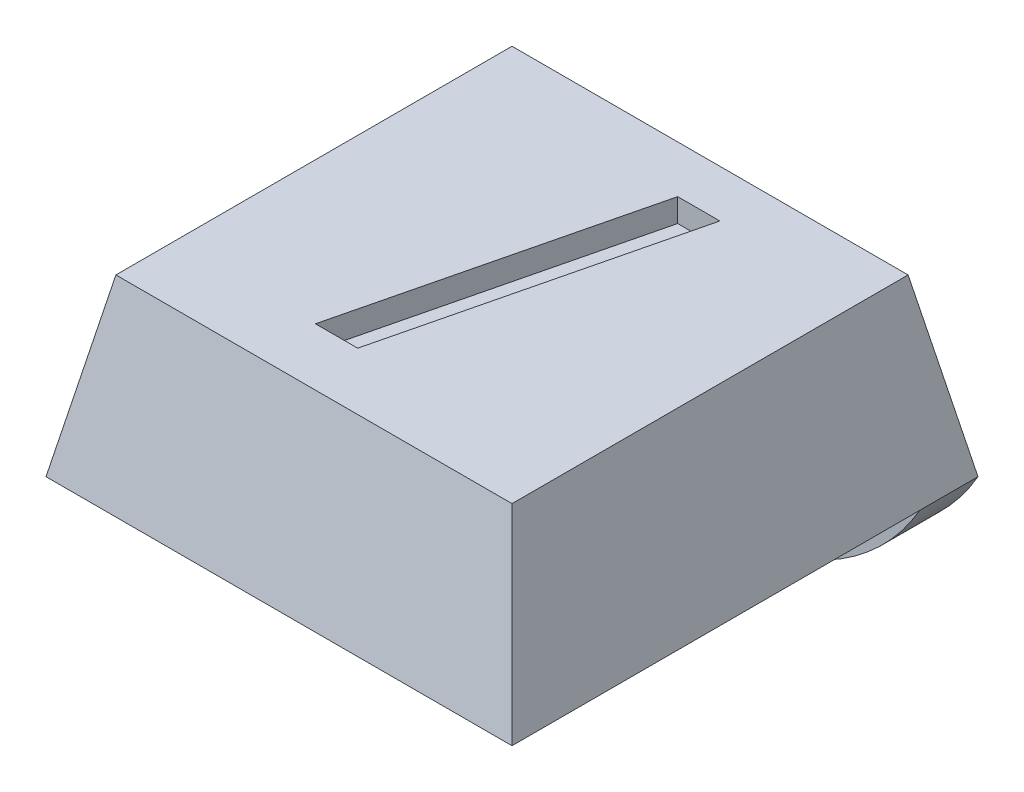
ISO-10303-21;
HEADER;
FILE_DESCRIPTION(('STEP AP214'),'2;1');
FILE_NAME('part.step','',(''),(''),'','','');
FILE_SCHEMA(('AUTOMOTIVE_DESIGN { 1 0 10303 214 1 1 1 1 }'));
ENDSEC;
DATA;
#1=APPLICATION_CONTEXT('core data for automotive mechanical design processes');
#2=APPLICATION_PROTOCOL_DEFINITION('international standard','automotive_design',2000,#1);
#3=PRODUCT_CONTEXT('',#1,'mechanical');
#4=PRODUCT('Part','Part','',(#3));
#5=PRODUCT_RELATED_PRODUCT_CATEGORY('part','',(#4));
#6=PRODUCT_DEFINITION_FORMATION('','',#4);
#7=PRODUCT_DEFINITION_CONTEXT('part definition',#1,'design');
#8=PRODUCT_DEFINITION('design','',#6,#7);
#9=PRODUCT_DEFINITION_SHAPE('','',#8);
#10=(LENGTH_UNIT() NAMED_UNIT(*) SI_UNIT(.MILLI.,.METRE.));
#11=(NAMED_UNIT(*) PLANE_ANGLE_UNIT() SI_UNIT($,.RADIAN.));
#12=(NAMED_UNIT(*) SI_UNIT($,.STERADIAN.) SOLID_ANGLE_UNIT());
#13=UNCERTAINTY_MEASURE_WITH_UNIT(LENGTH_MEASURE(1.E-05),#10,'distance_accuracy_value','');
#14=(GEOMETRIC_REPRESENTATION_CONTEXT(3) GLOBAL_UNCERTAINTY_ASSIGNED_CONTEXT((#13)) GLOBAL_UNIT_ASSIGNED_CONTEXT((#10,
#11,#12)) REPRESENTATION_CONTEXT('',''));
#15=CARTESIAN_POINT('',(0.,0.,0.));
#16=DIRECTION('',(0.,0.,1.));
#17=DIRECTION('',(1.,0.,0.));
#18=AXIS2_PLACEMENT_3D('',#15,#16,#17);
#19=CARTESIAN_POINT('',(0.,3.,0.));
#20=DIRECTION('',(0.,-1.,0.));
#21=DIRECTION('',(0.,0.,-1.));
#22=AXIS2_PLACEMENT_3D('',#19,#20,#21);
#23=PLANE('',#22);
#24=DIRECTION('',(-1.,0.,0.));
#25=VECTOR('',#24,1.);
#26=CARTESIAN_POINT('',(11.,3.,-0.6));
#27=LINE('',#26,#25);
#28=CARTESIAN_POINT('',(7.4,3.,-0.6));
#29=VERTEX_POINT('',#28);
#30=CARTESIAN_POINT('',(0.6,3.,-0.6));
#31=VERTEX_POINT('',#30);
#32=EDGE_CURVE('E180',#29,#31,#27,.T.);
#33=ORIENTED_EDGE('',*,*,#32,.F.);
#34=DIRECTION('',(0.,0.,1.));
#35=VECTOR('',#34,1.);
#36=CARTESIAN_POINT('',(7.4,3.,-8.));
#37=LINE('',#36,#35);
#38=CARTESIAN_POINT('',(7.4,3.,-7.4));
#39=VERTEX_POINT('',#38);
#40=EDGE_CURVE('E193',#39,#29,#37,.T.);
#41=ORIENTED_EDGE('',*,*,#40,.F.);
#42=DIRECTION('',(-1.,0.,0.));
#43=VECTOR('',#42,1.);
#44=CARTESIAN_POINT('',(11.,3.,-7.4));
#45=LINE('',#44,#43);
#46=CARTESIAN_POINT('',(0.599999999999999,3.,-7.4));
#47=VERTEX_POINT('',#46);
#48=EDGE_CURVE('E176',#39,#47,#45,.T.);
#49=ORIENTED_EDGE('',*,*,#48,.T.);
#50=DIRECTION('',(0.,0.,1.));
#51=VECTOR('',#50,1.);
#52=CARTESIAN_POINT('',(0.6,3.,-8.));
#53=LINE('',#52,#51);
#54=EDGE_CURVE('E196',#47,#31,#53,.T.);
#55=ORIENTED_EDGE('',*,*,#54,.T.);
#56=EDGE_LOOP('',(#33,#41,#49,#55));
#57=FACE_BOUND('',#56,.T.);
#58=DIRECTION('',(-1.,0.,0.));
#59=VECTOR('',#58,1.);
#60=CARTESIAN_POINT('',(3.76440167960569,3.,-1.58646920091357));
#61=LINE('',#60,#59);
#62=CARTESIAN_POINT('',(3.76440167960569,3.,-1.58646920091357));
#63=VERTEX_POINT('',#62);
#64=CARTESIAN_POINT('',(3.03924142319544,3.,-1.58646920091357));
#65=VERTEX_POINT('',#64);
#66=EDGE_CURVE('E58',#63,#65,#61,.T.);
#67=ORIENTED_EDGE('',*,*,#66,.T.);
#68=DIRECTION('',(0.23685313162707,0.,-0.9715454667891));
#69=VECTOR('',#68,1.);
#70=CARTESIAN_POINT('',(3.03924142319544,3.,-1.58646920091357));
#71=LINE('',#70,#69);
#72=CARTESIAN_POINT('',(4.25819174370826,3.,-6.58646920091357));
#73=VERTEX_POINT('',#72);
#74=EDGE_CURVE('E148',#65,#73,#71,.T.);
#75=ORIENTED_EDGE('',*,*,#74,.T.);
#76=DIRECTION('',(1.,0.,0.));
#77=VECTOR('',#76,1.);
#78=CARTESIAN_POINT('',(4.25819174370826,3.,-6.58646920091357));
#79=LINE('',#78,#77);
#80=CARTESIAN_POINT('',(4.98235039755441,3.,-6.58646920091357));
#81=VERTEX_POINT('',#80);
#82=EDGE_CURVE('E475',#73,#81,#79,.T.);
#83=ORIENTED_EDGE('',*,*,#82,.T.);
#84=DIRECTION('',(-0.23666941653505,0.,0.971590236301785));
#85=VECTOR('',#84,1.);
#86=CARTESIAN_POINT('',(4.98235039755441,3.,-6.58646920091357));
#87=LINE('',#86,#85);
#88=EDGE_CURVE('E144',#81,#63,#87,.T.);
#89=ORIENTED_EDGE('',*,*,#88,.T.);
#90=EDGE_LOOP('',(#67,#75,#83,#89));
#91=FACE_BOUND('',#90,.T.);
#92=ADVANCED_FACE('F42',(#57,#91),#23,.F.);
#93=CARTESIAN_POINT('',(8.,0.,-8.));
#94=DIRECTION('',(-0.98058067569092,-0.196116135138184,0.));
#95=DIRECTION('',(0.196116135138184,-0.98058067569092,0.));
#96=AXIS2_PLACEMENT_3D('',#93,#94,#95);
#97=PLANE('',#96);
#98=DIRECTION('',(-0.192450089729875,0.962250448649376,-0.192450089729875));
#99=VECTOR('',#98,1.);
#100=CARTESIAN_POINT('',(7.7037037037037,1.48148148148148,-0.296296296296296));
#101=LINE('',#100,#99);
#102=CARTESIAN_POINT('',(8.,0.,0.));
#103=VERTEX_POINT('',#102);
#104=EDGE_CURVE('E190',#103,#29,#101,.T.);
#105=ORIENTED_EDGE('',*,*,#104,.F.);
#106=DIRECTION('',(0.,0.,-1.));
#107=VECTOR('',#106,1.);
#108=CARTESIAN_POINT('',(8.,0.,0.));
#109=LINE('',#108,#107);
#110=CARTESIAN_POINT('',(8.,0.,-7.));
#111=VERTEX_POINT('',#110);
#112=EDGE_CURVE('E209',#103,#111,#109,.T.);
#113=ORIENTED_EDGE('',*,*,#112,.T.);
#114=DIRECTION('',(0.,0.,1.));
#115=VECTOR('',#114,1.);
#116=CARTESIAN_POINT('',(8.,0.,-8.));
#117=LINE('',#116,#115);
#118=CARTESIAN_POINT('',(8.,0.,-8.));
#119=VERTEX_POINT('',#118);
#120=EDGE_CURVE('E150',#119,#111,#117,.T.);
#121=ORIENTED_EDGE('',*,*,#120,.F.);
#122=DIRECTION('',(0.192450089729875,-0.962250448649376,-0.192450089729875));
#123=VECTOR('',#122,1.);
#124=CARTESIAN_POINT('',(8.,0.,-8.));
#125=LINE('',#124,#123);
#126=EDGE_CURVE('E183',#39,#119,#125,.T.);
#127=ORIENTED_EDGE('',*,*,#126,.F.);
#128=ORIENTED_EDGE('',*,*,#40,.T.);
#129=EDGE_LOOP('',(#105,#113,#121,#127,#128));
#130=FACE_BOUND('',#129,.T.);
#131=ADVANCED_FACE('F277',(#130),#97,.F.);
#132=CARTESIAN_POINT('',(0.,0.,-8.));
#133=DIRECTION('',(0.98058067569092,-0.196116135138184,0.));
#134=DIRECTION('',(0.196116135138184,0.98058067569092,0.));
#135=AXIS2_PLACEMENT_3D('',#132,#133,#134);
#136=PLANE('',#135);
#137=DIRECTION('',(-0.192450089729875,-0.962250448649376,0.192450089729875));
#138=VECTOR('',#137,1.);
#139=CARTESIAN_POINT('',(0.296296296296296,1.48148148148148,-0.296296296296296));
#140=LINE('',#139,#138);
#141=CARTESIAN_POINT('',(0.,0.,0.));
#142=VERTEX_POINT('',#141);
#143=EDGE_CURVE('E237',#31,#142,#140,.T.);
#144=ORIENTED_EDGE('',*,*,#143,.F.);
#145=ORIENTED_EDGE('',*,*,#54,.F.);
#146=DIRECTION('',(0.192450089729875,0.962250448649376,0.192450089729875));
#147=VECTOR('',#146,1.);
#148=CARTESIAN_POINT('',(0.,0.,-8.));
#149=LINE('',#148,#147);
#150=CARTESIAN_POINT('',(0.,0.,-8.));
#151=VERTEX_POINT('',#150);
#152=EDGE_CURVE('E208',#151,#47,#149,.T.);
#153=ORIENTED_EDGE('',*,*,#152,.F.);
#154=DIRECTION('',(0.,0.,1.));
#155=VECTOR('',#154,1.);
#156=CARTESIAN_POINT('',(0.,0.,0.));
#157=LINE('',#156,#155);
#158=CARTESIAN_POINT('',(0.,0.,-7.));
#159=VERTEX_POINT('',#158);
#160=EDGE_CURVE('E213',#151,#159,#157,.T.);
#161=ORIENTED_EDGE('',*,*,#160,.T.);
#162=EDGE_CURVE('E200',#159,#142,#157,.T.);
#163=ORIENTED_EDGE('',*,*,#162,.T.);
#164=EDGE_LOOP('',(#144,#145,#153,#161,#163));
#165=FACE_BOUND('',#164,.T.);
#166=ADVANCED_FACE('F261',(#165),#136,.F.);
#167=CARTESIAN_POINT('',(0.,0.,0.));
#168=DIRECTION('',(0.,-1.,0.));
#169=DIRECTION('',(0.,0.,-1.));
#170=AXIS2_PLACEMENT_3D('',#167,#168,#169);
#171=PLANE('',#170);
#172=DIRECTION('',(-1.,0.,0.));
#173=VECTOR('',#172,1.);
#174=CARTESIAN_POINT('',(0.,0.,-7.));
#175=LINE('',#174,#173);
#176=EDGE_CURVE('E156',#111,#159,#175,.T.);
#177=ORIENTED_EDGE('',*,*,#176,.F.);
#178=ORIENTED_EDGE('',*,*,#112,.F.);
#179=DIRECTION('',(1.,0.,0.));
#180=VECTOR('',#179,1.);
#181=CARTESIAN_POINT('',(0.,0.,0.));
#182=LINE('',#181,#180);
#183=EDGE_CURVE('E210',#142,#103,#182,.T.);
#184=ORIENTED_EDGE('',*,*,#183,.F.);
#185=ORIENTED_EDGE('',*,*,#162,.F.);
#186=EDGE_LOOP('',(#177,#178,#184,#185));
#187=FACE_BOUND('',#186,.T.);
#188=CARTESIAN_POINT('',(4.,0.,-3.75));
#189=DIRECTION('',(0.,-1.,0.));
#190=DIRECTION('',(0.,0.,-1.));
#191=AXIS2_PLACEMENT_3D('',#188,#189,#190);
#192=CIRCLE('',#191,1.8);
#193=CARTESIAN_POINT('',(4.,0.,-5.55));
#194=VERTEX_POINT('',#193);
#195=EDGE_CURVE('E168',#194,#194,#192,.T.);
#196=ORIENTED_EDGE('',*,*,#195,.F.);
#197=EDGE_LOOP('',(#196));
#198=FACE_BOUND('',#197,.T.);
#199=ADVANCED_FACE('F272',(#187,#198),#171,.T.);
#200=CARTESIAN_POINT('',(11.,3.,-7.4));
#201=DIRECTION('',(0.,0.196116135138184,-0.98058067569092));
#202=DIRECTION('',(0.,0.98058067569092,0.196116135138184));
#203=AXIS2_PLACEMENT_3D('',#200,#201,#202);
#204=PLANE('',#203);
#205=ORIENTED_EDGE('',*,*,#126,.T.);
#206=DIRECTION('',(-1.,0.,0.));
#207=VECTOR('',#206,1.);
#208=CARTESIAN_POINT('',(0.,0.,-8.));
#209=LINE('',#208,#207);
#210=EDGE_CURVE('E204',#119,#151,#209,.T.);
#211=ORIENTED_EDGE('',*,*,#210,.T.);
#212=ORIENTED_EDGE('',*,*,#152,.T.);
#213=ORIENTED_EDGE('',*,*,#48,.F.);
#214=EDGE_LOOP('',(#205,#211,#212,#213));
#215=FACE_BOUND('',#214,.T.);
#216=ADVANCED_FACE('F256',(#215),#204,.T.);
#217=CARTESIAN_POINT('',(11.,0.,0.));
#218=DIRECTION('',(0.,0.196116135138184,0.98058067569092));
#219=DIRECTION('',(0.,-0.98058067569092,0.196116135138184));
#220=AXIS2_PLACEMENT_3D('',#217,#218,#219);
#221=PLANE('',#220);
#222=ORIENTED_EDGE('',*,*,#104,.T.);
#223=ORIENTED_EDGE('',*,*,#32,.T.);
#224=ORIENTED_EDGE('',*,*,#143,.T.);
#225=ORIENTED_EDGE('',*,*,#183,.T.);
#226=EDGE_LOOP('',(#222,#223,#224,#225));
#227=FACE_BOUND('',#226,.T.);
#228=ADVANCED_FACE('F303',(#227),#221,.T.);
#229=CARTESIAN_POINT('',(4.,0.8,-3.75));
#230=DIRECTION('',(0.,-1.,0.));
#231=DIRECTION('',(0.,0.,-1.));
#232=AXIS2_PLACEMENT_3D('',#229,#230,#231);
#233=CYLINDRICAL_SURFACE('',#232,1.8);
#234=CARTESIAN_POINT('',(4.,0.8,-3.75));
#235=DIRECTION('',(0.,-1.,0.));
#236=DIRECTION('',(0.,0.,-1.));
#237=AXIS2_PLACEMENT_3D('',#234,#235,#236);
#238=CIRCLE('',#237,1.8);
#239=CARTESIAN_POINT('',(4.,0.8,-5.55));
#240=VERTEX_POINT('',#239);
#241=EDGE_CURVE('E172',#240,#240,#238,.T.);
#242=ORIENTED_EDGE('',*,*,#241,.F.);
#243=EDGE_LOOP('',(#242));
#244=FACE_BOUND('',#243,.T.);
#245=ORIENTED_EDGE('',*,*,#195,.T.);
#246=EDGE_LOOP('',(#245));
#247=FACE_BOUND('',#246,.T.);
#248=ADVANCED_FACE('F310',(#244,#247),#233,.F.);
#249=CARTESIAN_POINT('',(4.,0.8,-3.75));
#250=DIRECTION('',(0.,-1.,0.));
#251=DIRECTION('',(0.,0.,-1.));
#252=AXIS2_PLACEMENT_3D('',#249,#250,#251);
#253=PLANE('',#252);
#254=ORIENTED_EDGE('',*,*,#241,.T.);
#255=EDGE_LOOP('',(#254));
#256=FACE_BOUND('',#255,.T.);
#257=ADVANCED_FACE('F314',(#256),#253,.T.);
#258=CARTESIAN_POINT('',(0.,-2.,-8.));
#259=DIRECTION('',(0.,0.,1.));
#260=DIRECTION('',(1.,0.,0.));
#261=AXIS2_PLACEMENT_3D('',#258,#259,#260);
#262=PLANE('',#261);
#263=ORIENTED_EDGE('',*,*,#210,.F.);
#264=CARTESIAN_POINT('',(4.53589838486225,2.,-8.));
#265=DIRECTION('',(0.,0.,1.));
#266=DIRECTION('',(1.,0.,0.));
#267=AXIS2_PLACEMENT_3D('',#264,#265,#266);
#268=CIRCLE('',#267,4.);
#269=CARTESIAN_POINT('',(4.53589838486225,-2.,-8.));
#270=VERTEX_POINT('',#269);
#271=EDGE_CURVE('E11',#119,#270,#268,.F.);
#272=ORIENTED_EDGE('',*,*,#271,.T.);
#273=DIRECTION('',(1.,0.,0.));
#274=VECTOR('',#273,1.);
#275=CARTESIAN_POINT('',(0.,-2.,-8.));
#276=LINE('',#275,#274);
#277=CARTESIAN_POINT('',(3.46410161513775,-2.,-8.));
#278=VERTEX_POINT('',#277);
#279=EDGE_CURVE('E162',#278,#270,#276,.T.);
#280=ORIENTED_EDGE('',*,*,#279,.F.);
#281=CARTESIAN_POINT('',(3.46410161513775,2.,-8.));
#282=DIRECTION('',(0.,0.,1.));
#283=DIRECTION('',(1.,0.,0.));
#284=AXIS2_PLACEMENT_3D('',#281,#282,#283);
#285=CIRCLE('',#284,4.);
#286=EDGE_CURVE('E51',#278,#151,#285,.F.);
#287=ORIENTED_EDGE('',*,*,#286,.T.);
#288=EDGE_LOOP('',(#263,#272,#280,#287));
#289=FACE_BOUND('',#288,.T.);
#290=ADVANCED_FACE('F249',(#289),#262,.F.);
#291=CARTESIAN_POINT('',(0.,-2.,-7.));
#292=DIRECTION('',(0.,0.,-1.));
#293=DIRECTION('',(-1.,0.,0.));
#294=AXIS2_PLACEMENT_3D('',#291,#292,#293);
#295=PLANE('',#294);
#296=DIRECTION('',(-1.,0.,0.));
#297=VECTOR('',#296,1.);
#298=CARTESIAN_POINT('',(0.,-2.,-7.));
#299=LINE('',#298,#297);
#300=CARTESIAN_POINT('',(4.53589838486225,-2.,-7.));
#301=VERTEX_POINT('',#300);
#302=CARTESIAN_POINT('',(3.46410161513775,-2.,-7.));
#303=VERTEX_POINT('',#302);
#304=EDGE_CURVE('E166',#301,#303,#299,.T.);
#305=ORIENTED_EDGE('',*,*,#304,.F.);
#306=CARTESIAN_POINT('',(4.53589838486225,2.,-7.));
#307=DIRECTION('',(0.,0.,-1.));
#308=DIRECTION('',(-1.,0.,0.));
#309=AXIS2_PLACEMENT_3D('',#306,#307,#308);
#310=CIRCLE('',#309,4.);
#311=EDGE_CURVE('E243',#301,#111,#310,.F.);
#312=ORIENTED_EDGE('',*,*,#311,.T.);
#313=ORIENTED_EDGE('',*,*,#176,.T.);
#314=CARTESIAN_POINT('',(3.46410161513775,2.,-7.));
#315=DIRECTION('',(0.,0.,-1.));
#316=DIRECTION('',(-1.,0.,0.));
#317=AXIS2_PLACEMENT_3D('',#314,#315,#316);
#318=CIRCLE('',#317,4.);
#319=EDGE_CURVE('E66',#159,#303,#318,.F.);
#320=ORIENTED_EDGE('',*,*,#319,.T.);
#321=EDGE_LOOP('',(#305,#312,#313,#320));
#322=FACE_BOUND('',#321,.T.);
#323=ADVANCED_FACE('F267',(#322),#295,.F.);
#324=CARTESIAN_POINT('',(0.,-2.,0.));
#325=DIRECTION('',(0.,1.,0.));
#326=DIRECTION('',(0.,0.,1.));
#327=AXIS2_PLACEMENT_3D('',#324,#325,#326);
#328=PLANE('',#327);
#329=ORIENTED_EDGE('',*,*,#279,.T.);
#330=DIRECTION('',(0.,0.,1.));
#331=VECTOR('',#330,1.);
#332=CARTESIAN_POINT('',(4.53589838486225,-2.,0.));
#333=LINE('',#332,#331);
#334=EDGE_CURVE('E236',#270,#301,#333,.T.);
#335=ORIENTED_EDGE('',*,*,#334,.T.);
#336=ORIENTED_EDGE('',*,*,#304,.T.);
#337=DIRECTION('',(0.,0.,-1.));
#338=VECTOR('',#337,1.);
#339=CARTESIAN_POINT('',(3.46410161513775,-2.,0.));
#340=LINE('',#339,#338);
#341=EDGE_CURVE('E232',#303,#278,#340,.T.);
#342=ORIENTED_EDGE('',*,*,#341,.T.);
#343=EDGE_LOOP('',(#329,#335,#336,#342));
#344=FACE_BOUND('',#343,.T.);
#345=ADVANCED_FACE('F265',(#344),#328,.F.);
#346=CARTESIAN_POINT('',(4.53589838486225,2.,-8.));
#347=DIRECTION('',(0.,0.,1.));
#348=DIRECTION('',(1.,0.,0.));
#349=AXIS2_PLACEMENT_3D('',#346,#347,#348);
#350=CYLINDRICAL_SURFACE('',#349,4.);
#351=ORIENTED_EDGE('',*,*,#271,.F.);
#352=ORIENTED_EDGE('',*,*,#120,.T.);
#353=ORIENTED_EDGE('',*,*,#311,.F.);
#354=ORIENTED_EDGE('',*,*,#334,.F.);
#355=EDGE_LOOP('',(#351,#352,#353,#354));
#356=FACE_BOUND('',#355,.T.);
#357=ADVANCED_FACE('F278',(#356),#350,.T.);
#358=CARTESIAN_POINT('',(3.46410161513775,2.,-8.));
#359=DIRECTION('',(0.,0.,-1.));
#360=DIRECTION('',(-1.,0.,0.));
#361=AXIS2_PLACEMENT_3D('',#358,#359,#360);
#362=CYLINDRICAL_SURFACE('',#361,4.);
#363=ORIENTED_EDGE('',*,*,#319,.F.);
#364=ORIENTED_EDGE('',*,*,#160,.F.);
#365=ORIENTED_EDGE('',*,*,#286,.F.);
#366=ORIENTED_EDGE('',*,*,#341,.F.);
#367=EDGE_LOOP('',(#363,#364,#365,#366));
#368=FACE_BOUND('',#367,.T.);
#369=ADVANCED_FACE('F44',(#368),#362,.T.);
#370=CARTESIAN_POINT('',(3.76440167960569,2.6,-1.58646920091357));
#371=DIRECTION('',(0.,0.,-1.));
#372=DIRECTION('',(-1.,0.,0.));
#373=AXIS2_PLACEMENT_3D('',#370,#371,#372);
#374=PLANE('',#373);
#375=ORIENTED_EDGE('',*,*,#66,.F.);
#376=DIRECTION('',(0.,1.,0.));
#377=VECTOR('',#376,1.);
#378=CARTESIAN_POINT('',(3.76440167960569,2.6,-1.58646920091357));
#379=LINE('',#378,#377);
#380=CARTESIAN_POINT('',(3.76440167960569,2.6,-1.58646920091357));
#381=VERTEX_POINT('',#380);
#382=EDGE_CURVE('E142',#381,#63,#379,.T.);
#383=ORIENTED_EDGE('',*,*,#382,.F.);
#384=DIRECTION('',(-1.,0.,0.));
#385=VECTOR('',#384,1.);
#386=CARTESIAN_POINT('',(3.76440167960569,2.6,-1.58646920091357));
#387=LINE('',#386,#385);
#388=CARTESIAN_POINT('',(3.03924142319544,2.6,-1.58646920091357));
#389=VERTEX_POINT('',#388);
#390=EDGE_CURVE('E133',#381,#389,#387,.T.);
#391=ORIENTED_EDGE('',*,*,#390,.T.);
#392=DIRECTION('',(0.,1.,0.));
#393=VECTOR('',#392,1.);
#394=CARTESIAN_POINT('',(3.03924142319544,2.6,-1.58646920091357));
#395=LINE('',#394,#393);
#396=EDGE_CURVE('E141',#389,#65,#395,.T.);
#397=ORIENTED_EDGE('',*,*,#396,.T.);
#398=EDGE_LOOP('',(#375,#383,#391,#397));
#399=FACE_BOUND('',#398,.T.);
#400=ADVANCED_FACE('F140',(#399),#374,.T.);
#401=CARTESIAN_POINT('',(3.03924142319544,2.6,-1.58646920091357));
#402=DIRECTION('',(0.9715454667891,0.,0.23685313162707));
#403=DIRECTION('',(0.23685313162707,0.,-0.9715454667891));
#404=AXIS2_PLACEMENT_3D('',#401,#402,#403);
#405=PLANE('',#404);
#406=ORIENTED_EDGE('',*,*,#74,.F.);
#407=ORIENTED_EDGE('',*,*,#396,.F.);
#408=DIRECTION('',(0.23685313162707,0.,-0.9715454667891));
#409=VECTOR('',#408,1.);
#410=CARTESIAN_POINT('',(3.03924142319544,2.6,-1.58646920091357));
#411=LINE('',#410,#409);
#412=CARTESIAN_POINT('',(4.25819174370826,2.6,-6.58646920091357));
#413=VERTEX_POINT('',#412);
#414=EDGE_CURVE('E129',#389,#413,#411,.T.);
#415=ORIENTED_EDGE('',*,*,#414,.T.);
#416=DIRECTION('',(0.,1.,0.));
#417=VECTOR('',#416,1.);
#418=CARTESIAN_POINT('',(4.25819174370826,2.6,-6.58646920091357));
#419=LINE('',#418,#417);
#420=EDGE_CURVE('E151',#413,#73,#419,.T.);
#421=ORIENTED_EDGE('',*,*,#420,.T.);
#422=EDGE_LOOP('',(#406,#407,#415,#421));
#423=FACE_BOUND('',#422,.T.);
#424=ADVANCED_FACE('F146',(#423),#405,.T.);
#425=CARTESIAN_POINT('',(4.25819174370826,2.6,-6.58646920091357));
#426=DIRECTION('',(0.,0.,1.));
#427=DIRECTION('',(1.,0.,0.));
#428=AXIS2_PLACEMENT_3D('',#425,#426,#427);
#429=PLANE('',#428);
#430=ORIENTED_EDGE('',*,*,#82,.F.);
#431=ORIENTED_EDGE('',*,*,#420,.F.);
#432=DIRECTION('',(1.,0.,0.));
#433=VECTOR('',#432,1.);
#434=CARTESIAN_POINT('',(4.25819174370826,2.6,-6.58646920091357));
#435=LINE('',#434,#433);
#436=CARTESIAN_POINT('',(4.98235039755441,2.6,-6.58646920091357));
#437=VERTEX_POINT('',#436);
#438=EDGE_CURVE('E134',#413,#437,#435,.T.);
#439=ORIENTED_EDGE('',*,*,#438,.T.);
#440=DIRECTION('',(0.,1.,0.));
#441=VECTOR('',#440,1.);
#442=CARTESIAN_POINT('',(4.98235039755441,2.6,-6.58646920091357));
#443=LINE('',#442,#441);
#444=EDGE_CURVE('E158',#437,#81,#443,.T.);
#445=ORIENTED_EDGE('',*,*,#444,.T.);
#446=EDGE_LOOP('',(#430,#431,#439,#445));
#447=FACE_BOUND('',#446,.T.);
#448=ADVANCED_FACE('F327',(#447),#429,.T.);
#449=CARTESIAN_POINT('',(4.98235039755441,2.6,-6.58646920091357));
#450=DIRECTION('',(-0.971590236301785,0.,-0.23666941653505));
#451=DIRECTION('',(-0.23666941653505,0.,0.971590236301785));
#452=AXIS2_PLACEMENT_3D('',#449,#450,#451);
#453=PLANE('',#452);
#454=ORIENTED_EDGE('',*,*,#88,.F.);
#455=ORIENTED_EDGE('',*,*,#444,.F.);
#456=DIRECTION('',(-0.23666941653505,0.,0.971590236301785));
#457=VECTOR('',#456,1.);
#458=CARTESIAN_POINT('',(4.98235039755441,2.6,-6.58646920091357));
#459=LINE('',#458,#457);
#460=EDGE_CURVE('E485',#437,#381,#459,.T.);
#461=ORIENTED_EDGE('',*,*,#460,.T.);
#462=ORIENTED_EDGE('',*,*,#382,.T.);
#463=EDGE_LOOP('',(#454,#455,#461,#462));
#464=FACE_BOUND('',#463,.T.);
#465=ADVANCED_FACE('F330',(#464),#453,.T.);
#466=CARTESIAN_POINT('',(0.,2.6,0.));
#467=DIRECTION('',(0.,1.,0.));
#468=DIRECTION('',(0.,0.,1.));
#469=AXIS2_PLACEMENT_3D('',#466,#467,#468);
#470=PLANE('',#469);
#471=ORIENTED_EDGE('',*,*,#390,.F.);
#472=ORIENTED_EDGE('',*,*,#460,.F.);
#473=ORIENTED_EDGE('',*,*,#438,.F.);
#474=ORIENTED_EDGE('',*,*,#414,.F.);
#475=EDGE_LOOP('',(#471,#472,#473,#474));
#476=FACE_BOUND('',#475,.T.);
#477=ADVANCED_FACE('F131',(#476),#470,.T.);
#478=CLOSED_SHELL('',(#92,#131,#166,#199,#216,#228,#248,#257,#290,#323,#345,#357,#369,#400,#424,
#448,#465,#477));
#479=MANIFOLD_SOLID_BREP('B2',#478);
#480=ADVANCED_BREP_SHAPE_REPRESENTATION('',(#18,#479),#14);
#481=SHAPE_DEFINITION_REPRESENTATION(#9,#480);
ENDSEC;
END-ISO-10303-21;
